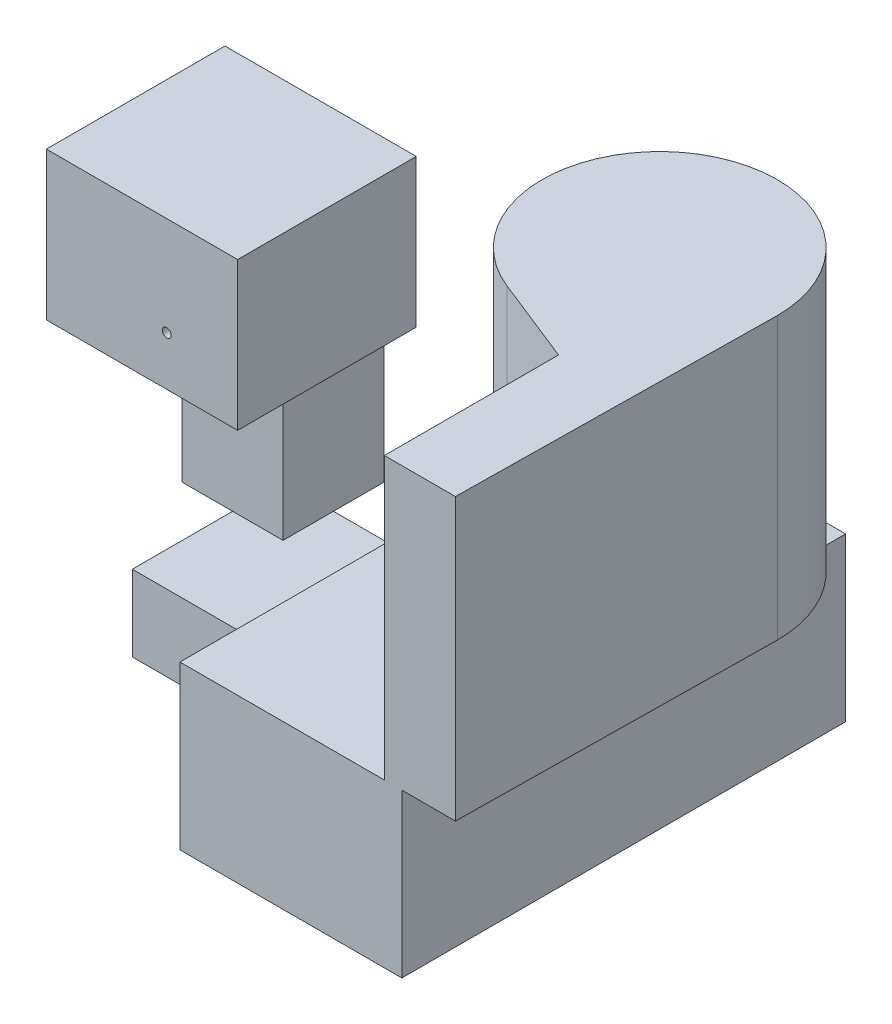
ISO-10303-21;
HEADER;
FILE_DESCRIPTION(('STEP AP214'),'2;1');
FILE_NAME('part.step','',(''),(''),'','','');
FILE_SCHEMA(('AUTOMOTIVE_DESIGN { 1 0 10303 214 1 1 1 1 }'));
ENDSEC;
DATA;
#1=APPLICATION_CONTEXT('core data for automotive mechanical design processes');
#2=APPLICATION_PROTOCOL_DEFINITION('international standard','automotive_design',2000,#1);
#3=PRODUCT_CONTEXT('',#1,'mechanical');
#4=PRODUCT('Part','Part','',(#3));
#5=PRODUCT_RELATED_PRODUCT_CATEGORY('part','',(#4));
#6=PRODUCT_DEFINITION_FORMATION('','',#4);
#7=PRODUCT_DEFINITION_CONTEXT('part definition',#1,'design');
#8=PRODUCT_DEFINITION('design','',#6,#7);
#9=PRODUCT_DEFINITION_SHAPE('','',#8);
#10=(LENGTH_UNIT() NAMED_UNIT(*) SI_UNIT(.MILLI.,.METRE.));
#11=(NAMED_UNIT(*) PLANE_ANGLE_UNIT() SI_UNIT($,.RADIAN.));
#12=(NAMED_UNIT(*) SI_UNIT($,.STERADIAN.) SOLID_ANGLE_UNIT());
#13=UNCERTAINTY_MEASURE_WITH_UNIT(LENGTH_MEASURE(1.E-05),#10,'distance_accuracy_value','');
#14=(GEOMETRIC_REPRESENTATION_CONTEXT(3) GLOBAL_UNCERTAINTY_ASSIGNED_CONTEXT((#13)) GLOBAL_UNIT_ASSIGNED_CONTEXT((#10,
#11,#12)) REPRESENTATION_CONTEXT('',''));
#15=CARTESIAN_POINT('',(0.,0.,0.));
#16=DIRECTION('',(0.,0.,1.));
#17=DIRECTION('',(1.,0.,0.));
#18=AXIS2_PLACEMENT_3D('',#15,#16,#17);
#19=CARTESIAN_POINT('',(-100.,-29.5726325797307,-67.7972337365636));
#20=DIRECTION('',(0.,-1.,0.));
#21=DIRECTION('',(0.,0.,-1.));
#22=AXIS2_PLACEMENT_3D('',#19,#20,#21);
#23=PLANE('',#22);
#24=DIRECTION('',(0.,0.,-1.));
#25=VECTOR('',#24,1.);
#26=CARTESIAN_POINT('',(-65.9132157314104,-29.5726325797307,-203.781166029621));
#27=LINE('',#26,#25);
#28=CARTESIAN_POINT('',(-65.9132157314104,-29.5726325797307,-135.607597492442));
#29=VERTEX_POINT('',#28);
#30=CARTESIAN_POINT('',(-65.9132157314104,-29.5726325797307,-169.694381761032));
#31=VERTEX_POINT('',#30);
#32=EDGE_CURVE('E216',#29,#31,#27,.T.);
#33=ORIENTED_EDGE('',*,*,#32,.F.);
#34=DIRECTION('',(1.,0.,0.));
#35=VECTOR('',#34,1.);
#36=CARTESIAN_POINT('',(-134.08678426859,-29.5726325797307,-135.607597492442));
#37=LINE('',#36,#35);
#38=CARTESIAN_POINT('',(-100.,-29.5726325797307,-135.607597492442));
#39=VERTEX_POINT('',#38);
#40=EDGE_CURVE('E241',#39,#29,#37,.T.);
#41=ORIENTED_EDGE('',*,*,#40,.F.);
#42=DIRECTION('',(0.,0.,-1.));
#43=VECTOR('',#42,1.);
#44=CARTESIAN_POINT('',(-100.,-29.5726325797307,-67.7972337365636));
#45=LINE('',#44,#43);
#46=CARTESIAN_POINT('',(-100.,-29.5726325797307,-67.7972337365636));
#47=VERTEX_POINT('',#46);
#48=EDGE_CURVE('E265',#47,#39,#45,.T.);
#49=ORIENTED_EDGE('',*,*,#48,.F.);
#50=DIRECTION('',(1.,0.,0.));
#51=VECTOR('',#50,1.);
#52=CARTESIAN_POINT('',(-100.,-29.5726325797307,-67.7972337365636));
#53=LINE('',#52,#51);
#54=CARTESIAN_POINT('',(0.,-29.5726325797307,-67.7972337365636));
#55=VERTEX_POINT('',#54);
#56=EDGE_CURVE('E51',#47,#55,#53,.T.);
#57=ORIENTED_EDGE('',*,*,#56,.T.);
#58=DIRECTION('',(0.,0.,-1.));
#59=VECTOR('',#58,1.);
#60=CARTESIAN_POINT('',(0.,-29.5726325797307,-67.7972337365636));
#61=LINE('',#60,#59);
#62=CARTESIAN_POINT('',(0.,-29.5726325797307,-169.694381761032));
#63=VERTEX_POINT('',#62);
#64=EDGE_CURVE('E260',#55,#63,#61,.T.);
#65=ORIENTED_EDGE('',*,*,#64,.T.);
#66=DIRECTION('',(1.,0.,0.));
#67=VECTOR('',#66,1.);
#68=CARTESIAN_POINT('',(-100.,-29.5726325797307,-169.694381761032));
#69=LINE('',#68,#67);
#70=EDGE_CURVE('E268',#31,#63,#69,.T.);
#71=ORIENTED_EDGE('',*,*,#70,.F.);
#72=EDGE_LOOP('',(#33,#41,#49,#57,#65,#71));
#73=FACE_BOUND('',#72,.T.);
#74=ADVANCED_FACE('F33',(#73),#23,.F.);
#75=CARTESIAN_POINT('',(0.,-110.,-300.));
#76=DIRECTION('',(-1.,0.,0.));
#77=DIRECTION('',(0.,0.,1.));
#78=AXIS2_PLACEMENT_3D('',#75,#76,#77);
#79=PLANE('',#78);
#80=DIRECTION('',(0.,0.,1.));
#81=VECTOR('',#80,1.);
#82=CARTESIAN_POINT('',(0.,0.,-300.));
#83=LINE('',#82,#81);
#84=CARTESIAN_POINT('',(0.,0.,-300.));
#85=VERTEX_POINT('',#84);
#86=CARTESIAN_POINT('',(0.,0.,0.));
#87=VERTEX_POINT('',#86);
#88=EDGE_CURVE('E351',#85,#87,#83,.T.);
#89=ORIENTED_EDGE('',*,*,#88,.F.);
#90=DIRECTION('',(0.,1.,0.));
#91=VECTOR('',#90,1.);
#92=CARTESIAN_POINT('',(0.,-110.,-300.));
#93=LINE('',#92,#91);
#94=CARTESIAN_POINT('',(0.,-110.,-300.));
#95=VERTEX_POINT('',#94);
#96=EDGE_CURVE('E348',#95,#85,#93,.T.);
#97=ORIENTED_EDGE('',*,*,#96,.F.);
#98=DIRECTION('',(0.,0.,1.));
#99=VECTOR('',#98,1.);
#100=CARTESIAN_POINT('',(0.,-110.,-300.));
#101=LINE('',#100,#99);
#102=CARTESIAN_POINT('',(0.,-110.,0.));
#103=VERTEX_POINT('',#102);
#104=EDGE_CURVE('E339',#95,#103,#101,.T.);
#105=ORIENTED_EDGE('',*,*,#104,.T.);
#106=DIRECTION('',(0.,1.,0.));
#107=VECTOR('',#106,1.);
#108=CARTESIAN_POINT('',(0.,-110.,0.));
#109=LINE('',#108,#107);
#110=EDGE_CURVE('E364',#103,#87,#109,.T.);
#111=ORIENTED_EDGE('',*,*,#110,.T.);
#112=EDGE_LOOP('',(#89,#97,#105,#111));
#113=FACE_BOUND('',#112,.T.);
#114=DIRECTION('',(0.,0.,1.));
#115=VECTOR('',#114,1.);
#116=CARTESIAN_POINT('',(0.,-80.9493458693783,-67.7972337365636));
#117=LINE('',#116,#115);
#118=CARTESIAN_POINT('',(0.,-80.9493458693783,-169.694381761032));
#119=VERTEX_POINT('',#118);
#120=CARTESIAN_POINT('',(0.,-80.9493458693783,-67.7972337365636));
#121=VERTEX_POINT('',#120);
#122=EDGE_CURVE('E271',#119,#121,#117,.T.);
#123=ORIENTED_EDGE('',*,*,#122,.F.);
#124=DIRECTION('',(0.,-1.,0.));
#125=VECTOR('',#124,1.);
#126=CARTESIAN_POINT('',(0.,-80.9493458693783,-169.694381761032));
#127=LINE('',#126,#125);
#128=EDGE_CURVE('E255',#63,#119,#127,.T.);
#129=ORIENTED_EDGE('',*,*,#128,.F.);
#130=ORIENTED_EDGE('',*,*,#64,.F.);
#131=DIRECTION('',(0.,1.,0.));
#132=VECTOR('',#131,1.);
#133=CARTESIAN_POINT('',(0.,-80.9493458693783,-67.7972337365636));
#134=LINE('',#133,#132);
#135=EDGE_CURVE('E273',#121,#55,#134,.T.);
#136=ORIENTED_EDGE('',*,*,#135,.F.);
#137=EDGE_LOOP('',(#123,#129,#130,#136));
#138=FACE_BOUND('',#137,.T.);
#139=ADVANCED_FACE('F374',(#113,#138),#79,.T.);
#140=CARTESIAN_POINT('',(150.,-110.,-300.));
#141=DIRECTION('',(0.,0.,-1.));
#142=DIRECTION('',(-1.,0.,0.));
#143=AXIS2_PLACEMENT_3D('',#140,#141,#142);
#144=PLANE('',#143);
#145=DIRECTION('',(-1.,0.,0.));
#146=VECTOR('',#145,1.);
#147=CARTESIAN_POINT('',(150.,0.,-300.));
#148=LINE('',#147,#146);
#149=CARTESIAN_POINT('',(150.,0.,-300.));
#150=VERTEX_POINT('',#149);
#151=EDGE_CURVE('E334',#150,#85,#148,.T.);
#152=ORIENTED_EDGE('',*,*,#151,.F.);
#153=DIRECTION('',(0.,1.,0.));
#154=VECTOR('',#153,1.);
#155=CARTESIAN_POINT('',(150.,-110.,-300.));
#156=LINE('',#155,#154);
#157=CARTESIAN_POINT('',(150.,-110.,-300.));
#158=VERTEX_POINT('',#157);
#159=EDGE_CURVE('E42',#158,#150,#156,.T.);
#160=ORIENTED_EDGE('',*,*,#159,.F.);
#161=DIRECTION('',(-1.,0.,0.));
#162=VECTOR('',#161,1.);
#163=CARTESIAN_POINT('',(150.,-110.,-300.));
#164=LINE('',#163,#162);
#165=EDGE_CURVE('E336',#158,#95,#164,.T.);
#166=ORIENTED_EDGE('',*,*,#165,.T.);
#167=ORIENTED_EDGE('',*,*,#96,.T.);
#168=EDGE_LOOP('',(#152,#160,#166,#167));
#169=FACE_BOUND('',#168,.T.);
#170=ADVANCED_FACE('F35',(#169),#144,.T.);
#171=CARTESIAN_POINT('',(150.,-110.,0.));
#172=DIRECTION('',(1.,0.,0.));
#173=DIRECTION('',(0.,0.,-1.));
#174=AXIS2_PLACEMENT_3D('',#171,#172,#173);
#175=PLANE('',#174);
#176=DIRECTION('',(0.,0.,-1.));
#177=VECTOR('',#176,1.);
#178=CARTESIAN_POINT('',(150.,0.,0.));
#179=LINE('',#178,#177);
#180=CARTESIAN_POINT('',(150.,0.,0.));
#181=VERTEX_POINT('',#180);
#182=CARTESIAN_POINT('',(150.,0.,-283.284509689981));
#183=VERTEX_POINT('',#182);
#184=EDGE_CURVE('E309',#181,#183,#179,.T.);
#185=ORIENTED_EDGE('',*,*,#184,.F.);
#186=DIRECTION('',(0.,1.,0.));
#187=VECTOR('',#186,1.);
#188=CARTESIAN_POINT('',(150.,-110.,0.));
#189=LINE('',#188,#187);
#190=CARTESIAN_POINT('',(150.,-110.,0.));
#191=VERTEX_POINT('',#190);
#192=EDGE_CURVE('E363',#191,#181,#189,.T.);
#193=ORIENTED_EDGE('',*,*,#192,.F.);
#194=DIRECTION('',(0.,0.,-1.));
#195=VECTOR('',#194,1.);
#196=CARTESIAN_POINT('',(150.,-110.,0.));
#197=LINE('',#196,#195);
#198=EDGE_CURVE('E345',#191,#158,#197,.T.);
#199=ORIENTED_EDGE('',*,*,#198,.T.);
#200=ORIENTED_EDGE('',*,*,#159,.T.);
#201=EDGE_CURVE('E356',#183,#150,#179,.T.);
#202=ORIENTED_EDGE('',*,*,#201,.F.);
#203=EDGE_LOOP('',(#185,#193,#199,#200,#202));
#204=FACE_BOUND('',#203,.T.);
#205=ADVANCED_FACE('F380',(#204),#175,.T.);
#206=CARTESIAN_POINT('',(0.,-110.,0.));
#207=DIRECTION('',(0.,0.,1.));
#208=DIRECTION('',(1.,0.,0.));
#209=AXIS2_PLACEMENT_3D('',#206,#207,#208);
#210=PLANE('',#209);
#211=DIRECTION('',(1.,0.,0.));
#212=VECTOR('',#211,1.);
#213=CARTESIAN_POINT('',(0.,0.,0.));
#214=LINE('',#213,#212);
#215=CARTESIAN_POINT('',(138.200643085254,0.,0.));
#216=VERTEX_POINT('',#215);
#217=EDGE_CURVE('E354',#87,#216,#214,.T.);
#218=ORIENTED_EDGE('',*,*,#217,.F.);
#219=ORIENTED_EDGE('',*,*,#110,.F.);
#220=DIRECTION('',(1.,0.,0.));
#221=VECTOR('',#220,1.);
#222=CARTESIAN_POINT('',(0.,-110.,0.));
#223=LINE('',#222,#221);
#224=EDGE_CURVE('E342',#103,#191,#223,.T.);
#225=ORIENTED_EDGE('',*,*,#224,.T.);
#226=ORIENTED_EDGE('',*,*,#192,.T.);
#227=DIRECTION('',(1.,0.,0.));
#228=VECTOR('',#227,1.);
#229=CARTESIAN_POINT('',(138.200643085254,0.,0.));
#230=LINE('',#229,#228);
#231=CARTESIAN_POINT('',(186.229076195475,0.,0.));
#232=VERTEX_POINT('',#231);
#233=EDGE_CURVE('E308',#181,#232,#230,.T.);
#234=ORIENTED_EDGE('',*,*,#233,.T.);
#235=DIRECTION('',(0.,-1.,0.));
#236=VECTOR('',#235,1.);
#237=CARTESIAN_POINT('',(186.229076195475,190.,0.));
#238=LINE('',#237,#236);
#239=CARTESIAN_POINT('',(186.229076195475,190.,0.));
#240=VERTEX_POINT('',#239);
#241=EDGE_CURVE('E315',#240,#232,#238,.T.);
#242=ORIENTED_EDGE('',*,*,#241,.F.);
#243=DIRECTION('',(1.,0.,0.));
#244=VECTOR('',#243,1.);
#245=CARTESIAN_POINT('',(138.200643085254,190.,0.));
#246=LINE('',#245,#244);
#247=CARTESIAN_POINT('',(138.200643085254,190.,0.));
#248=VERTEX_POINT('',#247);
#249=EDGE_CURVE('E293',#248,#240,#246,.T.);
#250=ORIENTED_EDGE('',*,*,#249,.F.);
#251=DIRECTION('',(0.,-1.,0.));
#252=VECTOR('',#251,1.);
#253=CARTESIAN_POINT('',(138.200643085254,190.,0.));
#254=LINE('',#253,#252);
#255=EDGE_CURVE('E312',#248,#216,#254,.T.);
#256=ORIENTED_EDGE('',*,*,#255,.T.);
#257=EDGE_LOOP('',(#218,#219,#225,#226,#234,#242,#250,#256));
#258=FACE_BOUND('',#257,.T.);
#259=ADVANCED_FACE('F385',(#258),#210,.T.);
#260=CARTESIAN_POINT('',(0.,-110.,0.));
#261=DIRECTION('',(0.,1.,0.));
#262=DIRECTION('',(0.,0.,1.));
#263=AXIS2_PLACEMENT_3D('',#260,#261,#262);
#264=PLANE('',#263);
#265=ORIENTED_EDGE('',*,*,#165,.F.);
#266=ORIENTED_EDGE('',*,*,#198,.F.);
#267=ORIENTED_EDGE('',*,*,#224,.F.);
#268=ORIENTED_EDGE('',*,*,#104,.F.);
#269=EDGE_LOOP('',(#265,#266,#267,#268));
#270=FACE_BOUND('',#269,.T.);
#271=ADVANCED_FACE('F383',(#270),#264,.F.);
#272=CARTESIAN_POINT('',(0.,0.,0.));
#273=DIRECTION('',(0.,1.,0.));
#274=DIRECTION('',(0.,0.,1.));
#275=AXIS2_PLACEMENT_3D('',#272,#273,#274);
#276=PLANE('',#275);
#277=CARTESIAN_POINT('',(109.546717841333,0.,-214.792084693344));
#278=DIRECTION('',(0.,1.,0.));
#279=DIRECTION('',(0.,0.,1.));
#280=AXIS2_PLACEMENT_3D('',#277,#278,#279);
#281=CIRCLE('',#280,79.5467178413331);
#282=CARTESIAN_POINT('',(80.0638199784776,0.,-140.910835022422));
#283=VERTEX_POINT('',#282);
#284=EDGE_CURVE('E11',#183,#283,#281,.T.);
#285=ORIENTED_EDGE('',*,*,#284,.F.);
#286=ORIENTED_EDGE('',*,*,#201,.T.);
#287=ORIENTED_EDGE('',*,*,#151,.T.);
#288=ORIENTED_EDGE('',*,*,#88,.T.);
#289=ORIENTED_EDGE('',*,*,#217,.T.);
#290=DIRECTION('',(0.,0.,1.));
#291=VECTOR('',#290,1.);
#292=CARTESIAN_POINT('',(138.200643085254,0.,-117.710875284836));
#293=LINE('',#292,#291);
#294=CARTESIAN_POINT('',(138.200643085254,0.,-117.710875284836));
#295=VERTEX_POINT('',#294);
#296=EDGE_CURVE('E300',#295,#216,#293,.T.);
#297=ORIENTED_EDGE('',*,*,#296,.F.);
#298=DIRECTION('',(0.928778102677828,0.,0.370636258326373));
#299=VECTOR('',#298,1.);
#300=CARTESIAN_POINT('',(80.0638199784776,0.,-140.910835022422));
#301=LINE('',#300,#299);
#302=EDGE_CURVE('E59',#283,#295,#301,.T.);
#303=ORIENTED_EDGE('',*,*,#302,.F.);
#304=EDGE_LOOP('',(#285,#286,#287,#288,#289,#297,#303));
#305=FACE_BOUND('',#304,.T.);
#306=ADVANCED_FACE('F376',(#305),#276,.T.);
#307=CARTESIAN_POINT('',(109.546717841333,0.,-214.792084693344));
#308=DIRECTION('',(0.,1.,0.));
#309=DIRECTION('',(0.,0.,1.));
#310=AXIS2_PLACEMENT_3D('',#307,#308,#309);
#311=PLANE('',#310);
#312=ORIENTED_EDGE('',*,*,#233,.F.);
#313=ORIENTED_EDGE('',*,*,#184,.T.);
#314=CARTESIAN_POINT('',(189.093435682666,0.,-214.792084693344));
#315=VERTEX_POINT('',#314);
#316=EDGE_CURVE('E44',#315,#183,#281,.T.);
#317=ORIENTED_EDGE('',*,*,#316,.F.);
#318=DIRECTION('',(0.0133343127276876,0.,-0.999911094099911));
#319=VECTOR('',#318,1.);
#320=CARTESIAN_POINT('',(186.229076195475,0.,0.));
#321=LINE('',#320,#319);
#322=EDGE_CURVE('E289',#232,#315,#321,.T.);
#323=ORIENTED_EDGE('',*,*,#322,.F.);
#324=EDGE_LOOP('',(#312,#313,#317,#323));
#325=FACE_BOUND('',#324,.T.);
#326=ADVANCED_FACE('F400',(#325),#311,.F.);
#327=CARTESIAN_POINT('',(109.546717841333,190.,-214.792084693344));
#328=DIRECTION('',(0.,-1.,0.));
#329=DIRECTION('',(0.,0.,-1.));
#330=AXIS2_PLACEMENT_3D('',#327,#328,#329);
#331=CYLINDRICAL_SURFACE('',#330,79.5467178413331);
#332=ORIENTED_EDGE('',*,*,#316,.T.);
#333=ORIENTED_EDGE('',*,*,#284,.T.);
#334=DIRECTION('',(0.,-1.,0.));
#335=VECTOR('',#334,1.);
#336=CARTESIAN_POINT('',(80.0638199784776,190.,-140.910835022422));
#337=LINE('',#336,#335);
#338=CARTESIAN_POINT('',(80.0638199784776,190.,-140.910835022422));
#339=VERTEX_POINT('',#338);
#340=EDGE_CURVE('E321',#339,#283,#337,.T.);
#341=ORIENTED_EDGE('',*,*,#340,.F.);
#342=CARTESIAN_POINT('',(109.546717841333,190.,-214.792084693344));
#343=DIRECTION('',(0.,1.,0.));
#344=DIRECTION('',(0.,0.,1.));
#345=AXIS2_PLACEMENT_3D('',#342,#343,#344);
#346=CIRCLE('',#345,79.5467178413331);
#347=CARTESIAN_POINT('',(189.093435682666,190.,-214.792084693344));
#348=VERTEX_POINT('',#347);
#349=EDGE_CURVE('E285',#348,#339,#346,.T.);
#350=ORIENTED_EDGE('',*,*,#349,.F.);
#351=DIRECTION('',(0.,-1.,0.));
#352=VECTOR('',#351,1.);
#353=CARTESIAN_POINT('',(189.093435682666,190.,-214.792084693344));
#354=LINE('',#353,#352);
#355=EDGE_CURVE('E296',#348,#315,#354,.T.);
#356=ORIENTED_EDGE('',*,*,#355,.T.);
#357=EDGE_LOOP('',(#332,#333,#341,#350,#356));
#358=FACE_BOUND('',#357,.T.);
#359=ADVANCED_FACE('F395',(#358),#331,.T.);
#360=CARTESIAN_POINT('',(80.0638199784776,190.,-140.910835022422));
#361=DIRECTION('',(0.370636258326373,0.,-0.928778102677828));
#362=DIRECTION('',(-0.928778102677828,0.,-0.370636258326373));
#363=AXIS2_PLACEMENT_3D('',#360,#361,#362);
#364=PLANE('',#363);
#365=ORIENTED_EDGE('',*,*,#302,.T.);
#366=DIRECTION('',(0.,-1.,0.));
#367=VECTOR('',#366,1.);
#368=CARTESIAN_POINT('',(138.200643085254,190.,-117.710875284836));
#369=LINE('',#368,#367);
#370=CARTESIAN_POINT('',(138.200643085254,190.,-117.710875284836));
#371=VERTEX_POINT('',#370);
#372=EDGE_CURVE('E314',#371,#295,#369,.T.);
#373=ORIENTED_EDGE('',*,*,#372,.F.);
#374=DIRECTION('',(0.928778102677828,0.,0.370636258326373));
#375=VECTOR('',#374,1.);
#376=CARTESIAN_POINT('',(80.0638199784776,190.,-140.910835022422));
#377=LINE('',#376,#375);
#378=EDGE_CURVE('E288',#339,#371,#377,.T.);
#379=ORIENTED_EDGE('',*,*,#378,.F.);
#380=ORIENTED_EDGE('',*,*,#340,.T.);
#381=EDGE_LOOP('',(#365,#373,#379,#380));
#382=FACE_BOUND('',#381,.T.);
#383=ADVANCED_FACE('F391',(#382),#364,.F.);
#384=CARTESIAN_POINT('',(138.200643085254,190.,-117.710875284836));
#385=DIRECTION('',(1.,0.,0.));
#386=DIRECTION('',(0.,0.,-1.));
#387=AXIS2_PLACEMENT_3D('',#384,#385,#386);
#388=PLANE('',#387);
#389=ORIENTED_EDGE('',*,*,#296,.T.);
#390=ORIENTED_EDGE('',*,*,#255,.F.);
#391=DIRECTION('',(0.,0.,1.));
#392=VECTOR('',#391,1.);
#393=CARTESIAN_POINT('',(138.200643085254,190.,-117.710875284836));
#394=LINE('',#393,#392);
#395=EDGE_CURVE('E291',#371,#248,#394,.T.);
#396=ORIENTED_EDGE('',*,*,#395,.F.);
#397=ORIENTED_EDGE('',*,*,#372,.T.);
#398=EDGE_LOOP('',(#389,#390,#396,#397));
#399=FACE_BOUND('',#398,.T.);
#400=ADVANCED_FACE('F387',(#399),#388,.F.);
#401=CARTESIAN_POINT('',(186.229076195475,190.,0.));
#402=DIRECTION('',(-0.999911094099911,0.,-0.0133343127276876));
#403=DIRECTION('',(-0.0133343127276876,0.,0.999911094099911));
#404=AXIS2_PLACEMENT_3D('',#401,#402,#403);
#405=PLANE('',#404);
#406=ORIENTED_EDGE('',*,*,#322,.T.);
#407=ORIENTED_EDGE('',*,*,#355,.F.);
#408=DIRECTION('',(0.0133343127276876,0.,-0.999911094099911));
#409=VECTOR('',#408,1.);
#410=CARTESIAN_POINT('',(186.229076195475,190.,0.));
#411=LINE('',#410,#409);
#412=EDGE_CURVE('E295',#240,#348,#411,.T.);
#413=ORIENTED_EDGE('',*,*,#412,.F.);
#414=ORIENTED_EDGE('',*,*,#241,.T.);
#415=EDGE_LOOP('',(#406,#407,#413,#414));
#416=FACE_BOUND('',#415,.T.);
#417=ADVANCED_FACE('F401',(#416),#405,.F.);
#418=CARTESIAN_POINT('',(109.546717841333,190.,-214.792084693344));
#419=DIRECTION('',(0.,1.,0.));
#420=DIRECTION('',(0.,0.,1.));
#421=AXIS2_PLACEMENT_3D('',#418,#419,#420);
#422=PLANE('',#421);
#423=ORIENTED_EDGE('',*,*,#349,.T.);
#424=ORIENTED_EDGE('',*,*,#378,.T.);
#425=ORIENTED_EDGE('',*,*,#395,.T.);
#426=ORIENTED_EDGE('',*,*,#249,.T.);
#427=ORIENTED_EDGE('',*,*,#412,.T.);
#428=EDGE_LOOP('',(#423,#424,#425,#426,#427));
#429=FACE_BOUND('',#428,.T.);
#430=ADVANCED_FACE('F403',(#429),#422,.T.);
#431=CARTESIAN_POINT('',(-100.,-80.9493458693783,-169.694381761032));
#432=DIRECTION('',(0.,0.,1.));
#433=DIRECTION('',(1.,0.,0.));
#434=AXIS2_PLACEMENT_3D('',#431,#432,#433);
#435=PLANE('',#434);
#436=ORIENTED_EDGE('',*,*,#128,.T.);
#437=DIRECTION('',(1.,0.,0.));
#438=VECTOR('',#437,1.);
#439=CARTESIAN_POINT('',(-100.,-80.9493458693783,-169.694381761032));
#440=LINE('',#439,#438);
#441=CARTESIAN_POINT('',(-100.,-80.9493458693783,-169.694381761032));
#442=VERTEX_POINT('',#441);
#443=EDGE_CURVE('E283',#442,#119,#440,.T.);
#444=ORIENTED_EDGE('',*,*,#443,.F.);
#445=DIRECTION('',(0.,-1.,0.));
#446=VECTOR('',#445,1.);
#447=CARTESIAN_POINT('',(-100.,-80.9493458693783,-169.694381761032));
#448=LINE('',#447,#446);
#449=CARTESIAN_POINT('',(-100.,-29.5726325797307,-169.694381761032));
#450=VERTEX_POINT('',#449);
#451=EDGE_CURVE('E256',#450,#442,#448,.T.);
#452=ORIENTED_EDGE('',*,*,#451,.F.);
#453=EDGE_CURVE('E276',#450,#31,#69,.T.);
#454=ORIENTED_EDGE('',*,*,#453,.T.);
#455=ORIENTED_EDGE('',*,*,#70,.T.);
#456=EDGE_LOOP('',(#436,#444,#452,#454,#455));
#457=FACE_BOUND('',#456,.T.);
#458=ADVANCED_FACE('F405',(#457),#435,.F.);
#459=CARTESIAN_POINT('',(-100.,-80.9493458693783,-67.7972337365636));
#460=DIRECTION('',(0.,1.,0.));
#461=DIRECTION('',(0.,0.,1.));
#462=AXIS2_PLACEMENT_3D('',#459,#460,#461);
#463=PLANE('',#462);
#464=ORIENTED_EDGE('',*,*,#122,.T.);
#465=DIRECTION('',(1.,0.,0.));
#466=VECTOR('',#465,1.);
#467=CARTESIAN_POINT('',(-100.,-80.9493458693783,-67.7972337365636));
#468=LINE('',#467,#466);
#469=CARTESIAN_POINT('',(-100.,-80.9493458693783,-67.7972337365636));
#470=VERTEX_POINT('',#469);
#471=EDGE_CURVE('E280',#470,#121,#468,.T.);
#472=ORIENTED_EDGE('',*,*,#471,.F.);
#473=DIRECTION('',(0.,0.,1.));
#474=VECTOR('',#473,1.);
#475=CARTESIAN_POINT('',(-100.,-80.9493458693783,-67.7972337365636));
#476=LINE('',#475,#474);
#477=EDGE_CURVE('E259',#442,#470,#476,.T.);
#478=ORIENTED_EDGE('',*,*,#477,.F.);
#479=ORIENTED_EDGE('',*,*,#443,.T.);
#480=EDGE_LOOP('',(#464,#472,#478,#479));
#481=FACE_BOUND('',#480,.T.);
#482=ADVANCED_FACE('F411',(#481),#463,.F.);
#483=CARTESIAN_POINT('',(-100.,-80.9493458693783,-67.7972337365636));
#484=DIRECTION('',(0.,0.,-1.));
#485=DIRECTION('',(-1.,0.,0.));
#486=AXIS2_PLACEMENT_3D('',#483,#484,#485);
#487=PLANE('',#486);
#488=ORIENTED_EDGE('',*,*,#135,.T.);
#489=ORIENTED_EDGE('',*,*,#56,.F.);
#490=DIRECTION('',(0.,1.,0.));
#491=VECTOR('',#490,1.);
#492=CARTESIAN_POINT('',(-100.,-80.9493458693783,-67.7972337365636));
#493=LINE('',#492,#491);
#494=EDGE_CURVE('E262',#470,#47,#493,.T.);
#495=ORIENTED_EDGE('',*,*,#494,.F.);
#496=ORIENTED_EDGE('',*,*,#471,.T.);
#497=EDGE_LOOP('',(#488,#489,#495,#496));
#498=FACE_BOUND('',#497,.T.);
#499=ADVANCED_FACE('F426',(#498),#487,.F.);
#500=CARTESIAN_POINT('',(-100.,0.,0.));
#501=DIRECTION('',(-1.,0.,0.));
#502=DIRECTION('',(0.,0.,1.));
#503=AXIS2_PLACEMENT_3D('',#500,#501,#502);
#504=PLANE('',#503);
#505=ORIENTED_EDGE('',*,*,#451,.T.);
#506=ORIENTED_EDGE('',*,*,#477,.T.);
#507=ORIENTED_EDGE('',*,*,#494,.T.);
#508=ORIENTED_EDGE('',*,*,#48,.T.);
#509=EDGE_CURVE('E264',#39,#450,#45,.T.);
#510=ORIENTED_EDGE('',*,*,#509,.T.);
#511=EDGE_LOOP('',(#505,#506,#507,#508,#510));
#512=FACE_BOUND('',#511,.T.);
#513=ADVANCED_FACE('F424',(#512),#504,.T.);
#514=CARTESIAN_POINT('',(0.,-29.5726325797307,0.));
#515=DIRECTION('',(0.,1.,0.));
#516=DIRECTION('',(0.,0.,1.));
#517=AXIS2_PLACEMENT_3D('',#514,#515,#516);
#518=PLANE('',#517);
#519=CARTESIAN_POINT('',(-65.9132157314104,-29.5726325797307,-203.781166029621));
#520=VERTEX_POINT('',#519);
#521=EDGE_CURVE('E214',#31,#520,#27,.T.);
#522=ORIENTED_EDGE('',*,*,#521,.F.);
#523=ORIENTED_EDGE('',*,*,#453,.F.);
#524=ORIENTED_EDGE('',*,*,#509,.F.);
#525=CARTESIAN_POINT('',(-134.08678426859,-29.5726325797307,-135.607597492442));
#526=VERTEX_POINT('',#525);
#527=EDGE_CURVE('E226',#526,#39,#37,.T.);
#528=ORIENTED_EDGE('',*,*,#527,.F.);
#529=DIRECTION('',(0.,0.,1.));
#530=VECTOR('',#529,1.);
#531=CARTESIAN_POINT('',(-134.08678426859,-29.5726325797307,-203.781166029621));
#532=LINE('',#531,#530);
#533=CARTESIAN_POINT('',(-134.08678426859,-29.5726325797307,-203.781166029621));
#534=VERTEX_POINT('',#533);
#535=EDGE_CURVE('E239',#534,#526,#532,.T.);
#536=ORIENTED_EDGE('',*,*,#535,.F.);
#537=DIRECTION('',(-1.,0.,0.));
#538=VECTOR('',#537,1.);
#539=CARTESIAN_POINT('',(-134.08678426859,-29.5726325797307,-203.781166029621));
#540=LINE('',#539,#538);
#541=EDGE_CURVE('E237',#520,#534,#540,.T.);
#542=ORIENTED_EDGE('',*,*,#541,.F.);
#543=EDGE_LOOP('',(#522,#523,#524,#528,#536,#542));
#544=FACE_BOUND('',#543,.T.);
#545=ADVANCED_FACE('F446',(#544),#518,.F.);
#546=CARTESIAN_POINT('',(-65.9132157314104,70.4273674202693,-203.781166029621));
#547=DIRECTION('',(-1.,0.,0.));
#548=DIRECTION('',(0.,0.,1.));
#549=AXIS2_PLACEMENT_3D('',#546,#547,#548);
#550=PLANE('',#549);
#551=ORIENTED_EDGE('',*,*,#32,.T.);
#552=ORIENTED_EDGE('',*,*,#521,.T.);
#553=DIRECTION('',(0.,-1.,0.));
#554=VECTOR('',#553,1.);
#555=CARTESIAN_POINT('',(-65.9132157314104,70.4273674202693,-203.781166029621));
#556=LINE('',#555,#554);
#557=CARTESIAN_POINT('',(-65.9132157314104,70.4273674202693,-203.781166029621));
#558=VERTEX_POINT('',#557);
#559=EDGE_CURVE('E252',#558,#520,#556,.T.);
#560=ORIENTED_EDGE('',*,*,#559,.F.);
#561=DIRECTION('',(0.,0.,-1.));
#562=VECTOR('',#561,1.);
#563=CARTESIAN_POINT('',(-65.9132157314104,70.4273674202693,-203.781166029621));
#564=LINE('',#563,#562);
#565=CARTESIAN_POINT('',(-65.9132157314104,70.4273674202693,-135.607597492442));
#566=VERTEX_POINT('',#565);
#567=EDGE_CURVE('E222',#566,#558,#564,.T.);
#568=ORIENTED_EDGE('',*,*,#567,.F.);
#569=DIRECTION('',(0.,-1.,0.));
#570=VECTOR('',#569,1.);
#571=CARTESIAN_POINT('',(-65.9132157314104,70.4273674202693,-135.607597492442));
#572=LINE('',#571,#570);
#573=EDGE_CURVE('E234',#566,#29,#572,.T.);
#574=ORIENTED_EDGE('',*,*,#573,.T.);
#575=EDGE_LOOP('',(#551,#552,#560,#568,#574));
#576=FACE_BOUND('',#575,.T.);
#577=ADVANCED_FACE('F455',(#576),#550,.F.);
#578=CARTESIAN_POINT('',(-134.08678426859,70.4273674202693,-203.781166029621));
#579=DIRECTION('',(0.,0.,1.));
#580=DIRECTION('',(1.,0.,0.));
#581=AXIS2_PLACEMENT_3D('',#578,#579,#580);
#582=PLANE('',#581);
#583=ORIENTED_EDGE('',*,*,#541,.T.);
#584=DIRECTION('',(0.,-1.,0.));
#585=VECTOR('',#584,1.);
#586=CARTESIAN_POINT('',(-134.08678426859,70.4273674202693,-203.781166029621));
#587=LINE('',#586,#585);
#588=CARTESIAN_POINT('',(-134.08678426859,70.4273674202693,-203.781166029621));
#589=VERTEX_POINT('',#588);
#590=EDGE_CURVE('E249',#589,#534,#587,.T.);
#591=ORIENTED_EDGE('',*,*,#590,.F.);
#592=DIRECTION('',(-1.,0.,0.));
#593=VECTOR('',#592,1.);
#594=CARTESIAN_POINT('',(-134.08678426859,70.4273674202693,-203.781166029621));
#595=LINE('',#594,#593);
#596=EDGE_CURVE('E225',#558,#589,#595,.T.);
#597=ORIENTED_EDGE('',*,*,#596,.F.);
#598=ORIENTED_EDGE('',*,*,#559,.T.);
#599=EDGE_LOOP('',(#583,#591,#597,#598));
#600=FACE_BOUND('',#599,.T.);
#601=ADVANCED_FACE('F464',(#600),#582,.F.);
#602=CARTESIAN_POINT('',(-134.08678426859,70.4273674202693,-203.781166029621));
#603=DIRECTION('',(1.,0.,0.));
#604=DIRECTION('',(0.,0.,-1.));
#605=AXIS2_PLACEMENT_3D('',#602,#603,#604);
#606=PLANE('',#605);
#607=ORIENTED_EDGE('',*,*,#535,.T.);
#608=DIRECTION('',(0.,-1.,0.));
#609=VECTOR('',#608,1.);
#610=CARTESIAN_POINT('',(-134.08678426859,70.4273674202693,-135.607597492442));
#611=LINE('',#610,#609);
#612=CARTESIAN_POINT('',(-134.08678426859,70.4273674202693,-135.607597492442));
#613=VERTEX_POINT('',#612);
#614=EDGE_CURVE('E246',#613,#526,#611,.T.);
#615=ORIENTED_EDGE('',*,*,#614,.F.);
#616=DIRECTION('',(0.,0.,1.));
#617=VECTOR('',#616,1.);
#618=CARTESIAN_POINT('',(-134.08678426859,70.4273674202693,-203.781166029621));
#619=LINE('',#618,#617);
#620=EDGE_CURVE('E229',#589,#613,#619,.T.);
#621=ORIENTED_EDGE('',*,*,#620,.F.);
#622=ORIENTED_EDGE('',*,*,#590,.T.);
#623=EDGE_LOOP('',(#607,#615,#621,#622));
#624=FACE_BOUND('',#623,.T.);
#625=ADVANCED_FACE('F462',(#624),#606,.F.);
#626=CARTESIAN_POINT('',(-134.08678426859,70.4273674202693,-135.607597492442));
#627=DIRECTION('',(0.,0.,-1.));
#628=DIRECTION('',(-1.,0.,0.));
#629=AXIS2_PLACEMENT_3D('',#626,#627,#628);
#630=PLANE('',#629);
#631=ORIENTED_EDGE('',*,*,#527,.T.);
#632=ORIENTED_EDGE('',*,*,#40,.T.);
#633=ORIENTED_EDGE('',*,*,#573,.F.);
#634=DIRECTION('',(1.,0.,0.));
#635=VECTOR('',#634,1.);
#636=CARTESIAN_POINT('',(-134.08678426859,70.4273674202693,-135.607597492442));
#637=LINE('',#636,#635);
#638=EDGE_CURVE('E232',#613,#566,#637,.T.);
#639=ORIENTED_EDGE('',*,*,#638,.F.);
#640=ORIENTED_EDGE('',*,*,#614,.T.);
#641=EDGE_LOOP('',(#631,#632,#633,#639,#640));
#642=FACE_BOUND('',#641,.T.);
#643=ADVANCED_FACE('F452',(#642),#630,.F.);
#644=CARTESIAN_POINT('',(0.,70.4273674202693,0.));
#645=DIRECTION('',(0.,1.,0.));
#646=DIRECTION('',(0.,0.,1.));
#647=AXIS2_PLACEMENT_3D('',#644,#645,#646);
#648=PLANE('',#647);
#649=DIRECTION('',(0.,0.,-1.));
#650=VECTOR('',#649,1.);
#651=CARTESIAN_POINT('',(-45.7084907307098,70.4273674202693,-205.444011425078));
#652=LINE('',#651,#650);
#653=CARTESIAN_POINT('',(-45.7084907307098,70.4273674202693,-84.7087351944062));
#654=VERTEX_POINT('',#653);
#655=CARTESIAN_POINT('',(-45.7084907307098,70.4273674202693,-205.444011425078));
#656=VERTEX_POINT('',#655);
#657=EDGE_CURVE('E213',#654,#656,#652,.T.);
#658=ORIENTED_EDGE('',*,*,#657,.F.);
#659=DIRECTION('',(1.,0.,0.));
#660=VECTOR('',#659,1.);
#661=CARTESIAN_POINT('',(-175.006552509657,70.4273674202693,-84.7087351944062));
#662=LINE('',#661,#660);
#663=CARTESIAN_POINT('',(-175.006552509657,70.4273674202693,-84.7087351944062));
#664=VERTEX_POINT('',#663);
#665=EDGE_CURVE('E209',#664,#654,#662,.T.);
#666=ORIENTED_EDGE('',*,*,#665,.F.);
#667=DIRECTION('',(0.,0.,1.));
#668=VECTOR('',#667,1.);
#669=CARTESIAN_POINT('',(-175.006552509657,70.4273674202693,-205.444011425078));
#670=LINE('',#669,#668);
#671=CARTESIAN_POINT('',(-175.006552509657,70.4273674202693,-205.444011425078));
#672=VERTEX_POINT('',#671);
#673=EDGE_CURVE('E516',#672,#664,#670,.T.);
#674=ORIENTED_EDGE('',*,*,#673,.F.);
#675=DIRECTION('',(-1.,0.,0.));
#676=VECTOR('',#675,1.);
#677=CARTESIAN_POINT('',(-175.006552509657,70.4273674202693,-205.444011425078));
#678=LINE('',#677,#676);
#679=EDGE_CURVE('E508',#656,#672,#678,.T.);
#680=ORIENTED_EDGE('',*,*,#679,.F.);
#681=EDGE_LOOP('',(#658,#666,#674,#680));
#682=FACE_BOUND('',#681,.T.);
#683=ORIENTED_EDGE('',*,*,#638,.T.);
#684=ORIENTED_EDGE('',*,*,#567,.T.);
#685=ORIENTED_EDGE('',*,*,#596,.T.);
#686=ORIENTED_EDGE('',*,*,#620,.T.);
#687=EDGE_LOOP('',(#683,#684,#685,#686));
#688=FACE_BOUND('',#687,.T.);
#689=ADVANCED_FACE('F458',(#682,#688),#648,.F.);
#690=CARTESIAN_POINT('',(-45.7084907307098,170.427367420269,-205.444011425078));
#691=DIRECTION('',(-1.,0.,0.));
#692=DIRECTION('',(0.,0.,1.));
#693=AXIS2_PLACEMENT_3D('',#690,#691,#692);
#694=PLANE('',#693);
#695=ORIENTED_EDGE('',*,*,#657,.T.);
#696=DIRECTION('',(0.,-1.,0.));
#697=VECTOR('',#696,1.);
#698=CARTESIAN_POINT('',(-45.7084907307098,170.427367420269,-205.444011425078));
#699=LINE('',#698,#697);
#700=CARTESIAN_POINT('',(-45.7084907307098,170.427367420269,-205.444011425078));
#701=VERTEX_POINT('',#700);
#702=EDGE_CURVE('E193',#701,#656,#699,.T.);
#703=ORIENTED_EDGE('',*,*,#702,.F.);
#704=DIRECTION('',(0.,0.,-1.));
#705=VECTOR('',#704,1.);
#706=CARTESIAN_POINT('',(-45.7084907307098,170.427367420269,-205.444011425078));
#707=LINE('',#706,#705);
#708=CARTESIAN_POINT('',(-45.7084907307098,170.427367420269,-84.7087351944062));
#709=VERTEX_POINT('',#708);
#710=EDGE_CURVE('E200',#709,#701,#707,.T.);
#711=ORIENTED_EDGE('',*,*,#710,.F.);
#712=DIRECTION('',(0.,-1.,0.));
#713=VECTOR('',#712,1.);
#714=CARTESIAN_POINT('',(-45.7084907307098,170.427367420269,-84.7087351944062));
#715=LINE('',#714,#713);
#716=EDGE_CURVE('E513',#709,#654,#715,.T.);
#717=ORIENTED_EDGE('',*,*,#716,.T.);
#718=EDGE_LOOP('',(#695,#703,#711,#717));
#719=FACE_BOUND('',#718,.T.);
#720=ADVANCED_FACE('F211',(#719),#694,.F.);
#721=CARTESIAN_POINT('',(-175.006552509657,170.427367420269,-205.444011425078));
#722=DIRECTION('',(0.,0.,1.));
#723=DIRECTION('',(1.,0.,0.));
#724=AXIS2_PLACEMENT_3D('',#721,#722,#723);
#725=PLANE('',#724);
#726=CARTESIAN_POINT('',(-93.6258986839071,103.612565913451,-205.444011425078));
#727=DIRECTION('',(0.,0.,1.));
#728=DIRECTION('',(1.,0.,0.));
#729=AXIS2_PLACEMENT_3D('',#726,#727,#728);
#730=CIRCLE('',#729,3.00000000000001);
#731=CARTESIAN_POINT('',(-90.6258986839071,103.612565913451,-205.444011425078));
#732=VERTEX_POINT('',#731);
#733=EDGE_CURVE('E506',#732,#732,#730,.T.);
#734=ORIENTED_EDGE('',*,*,#733,.T.);
#735=EDGE_LOOP('',(#734));
#736=FACE_BOUND('',#735,.T.);
#737=ORIENTED_EDGE('',*,*,#679,.T.);
#738=DIRECTION('',(0.,-1.,0.));
#739=VECTOR('',#738,1.);
#740=CARTESIAN_POINT('',(-175.006552509657,170.427367420269,-205.444011425078));
#741=LINE('',#740,#739);
#742=CARTESIAN_POINT('',(-175.006552509657,170.427367420269,-205.444011425078));
#743=VERTEX_POINT('',#742);
#744=EDGE_CURVE('E196',#743,#672,#741,.T.);
#745=ORIENTED_EDGE('',*,*,#744,.F.);
#746=DIRECTION('',(-1.,0.,0.));
#747=VECTOR('',#746,1.);
#748=CARTESIAN_POINT('',(-175.006552509657,170.427367420269,-205.444011425078));
#749=LINE('',#748,#747);
#750=EDGE_CURVE('E189',#701,#743,#749,.T.);
#751=ORIENTED_EDGE('',*,*,#750,.F.);
#752=ORIENTED_EDGE('',*,*,#702,.T.);
#753=EDGE_LOOP('',(#737,#745,#751,#752));
#754=FACE_BOUND('',#753,.T.);
#755=ADVANCED_FACE('F191',(#736,#754),#725,.F.);
#756=CARTESIAN_POINT('',(-175.006552509657,170.427367420269,-205.444011425078));
#757=DIRECTION('',(1.,0.,0.));
#758=DIRECTION('',(0.,0.,-1.));
#759=AXIS2_PLACEMENT_3D('',#756,#757,#758);
#760=PLANE('',#759);
#761=ORIENTED_EDGE('',*,*,#673,.T.);
#762=DIRECTION('',(0.,-1.,0.));
#763=VECTOR('',#762,1.);
#764=CARTESIAN_POINT('',(-175.006552509657,170.427367420269,-84.7087351944062));
#765=LINE('',#764,#763);
#766=CARTESIAN_POINT('',(-175.006552509657,170.427367420269,-84.7087351944062));
#767=VERTEX_POINT('',#766);
#768=EDGE_CURVE('E218',#767,#664,#765,.T.);
#769=ORIENTED_EDGE('',*,*,#768,.F.);
#770=DIRECTION('',(0.,0.,1.));
#771=VECTOR('',#770,1.);
#772=CARTESIAN_POINT('',(-175.006552509657,170.427367420269,-205.444011425078));
#773=LINE('',#772,#771);
#774=EDGE_CURVE('E199',#743,#767,#773,.T.);
#775=ORIENTED_EDGE('',*,*,#774,.F.);
#776=ORIENTED_EDGE('',*,*,#744,.T.);
#777=EDGE_LOOP('',(#761,#769,#775,#776));
#778=FACE_BOUND('',#777,.T.);
#779=ADVANCED_FACE('F481',(#778),#760,.F.);
#780=CARTESIAN_POINT('',(-175.006552509657,170.427367420269,-84.7087351944062));
#781=DIRECTION('',(0.,0.,-1.));
#782=DIRECTION('',(-1.,0.,0.));
#783=AXIS2_PLACEMENT_3D('',#780,#781,#782);
#784=PLANE('',#783);
#785=CARTESIAN_POINT('',(-93.6258986839071,103.612565913451,-84.7087351944062));
#786=DIRECTION('',(0.,0.,1.));
#787=DIRECTION('',(1.,0.,0.));
#788=AXIS2_PLACEMENT_3D('',#785,#786,#787);
#789=CIRCLE('',#788,3.00000000000001);
#790=CARTESIAN_POINT('',(-90.6258986839071,103.612565913451,-84.7087351944062));
#791=VERTEX_POINT('',#790);
#792=EDGE_CURVE('E503',#791,#791,#789,.T.);
#793=ORIENTED_EDGE('',*,*,#792,.F.);
#794=EDGE_LOOP('',(#793));
#795=FACE_BOUND('',#794,.T.);
#796=ORIENTED_EDGE('',*,*,#665,.T.);
#797=ORIENTED_EDGE('',*,*,#716,.F.);
#798=DIRECTION('',(1.,0.,0.));
#799=VECTOR('',#798,1.);
#800=CARTESIAN_POINT('',(-175.006552509657,170.427367420269,-84.7087351944062));
#801=LINE('',#800,#799);
#802=EDGE_CURVE('E205',#767,#709,#801,.T.);
#803=ORIENTED_EDGE('',*,*,#802,.F.);
#804=ORIENTED_EDGE('',*,*,#768,.T.);
#805=EDGE_LOOP('',(#796,#797,#803,#804));
#806=FACE_BOUND('',#805,.T.);
#807=ADVANCED_FACE('F485',(#795,#806),#784,.F.);
#808=CARTESIAN_POINT('',(0.,170.427367420269,0.));
#809=DIRECTION('',(0.,1.,0.));
#810=DIRECTION('',(0.,0.,1.));
#811=AXIS2_PLACEMENT_3D('',#808,#809,#810);
#812=PLANE('',#811);
#813=ORIENTED_EDGE('',*,*,#710,.T.);
#814=ORIENTED_EDGE('',*,*,#750,.T.);
#815=ORIENTED_EDGE('',*,*,#774,.T.);
#816=ORIENTED_EDGE('',*,*,#802,.T.);
#817=EDGE_LOOP('',(#813,#814,#815,#816));
#818=FACE_BOUND('',#817,.T.);
#819=ADVANCED_FACE('F203',(#818),#812,.T.);
#820=CARTESIAN_POINT('',(-93.6258986839071,103.612565913451,-244.708735194406));
#821=DIRECTION('',(0.,0.,1.));
#822=DIRECTION('',(1.,0.,0.));
#823=AXIS2_PLACEMENT_3D('',#820,#821,#822);
#824=CYLINDRICAL_SURFACE('',#823,3.00000000000001);
#825=ORIENTED_EDGE('',*,*,#792,.T.);
#826=EDGE_LOOP('',(#825));
#827=FACE_BOUND('',#826,.T.);
#828=ORIENTED_EDGE('',*,*,#733,.F.);
#829=EDGE_LOOP('',(#828));
#830=FACE_BOUND('',#829,.T.);
#831=ADVANCED_FACE('F495',(#827,#830),#824,.F.);
#832=CLOSED_SHELL('',(#74,#139,#170,#205,#259,#271,#306,#326,#359,#383,#400,#417,#430,#458,#482,
#499,#513,#545,#577,#601,#625,#643,#689,#720,#755,#779,#807,#819,#831));
#833=MANIFOLD_SOLID_BREP('B2',#832);
#834=ADVANCED_BREP_SHAPE_REPRESENTATION('',(#18,#833),#14);
#835=SHAPE_DEFINITION_REPRESENTATION(#9,#834);
ENDSEC;
END-ISO-10303-21;
